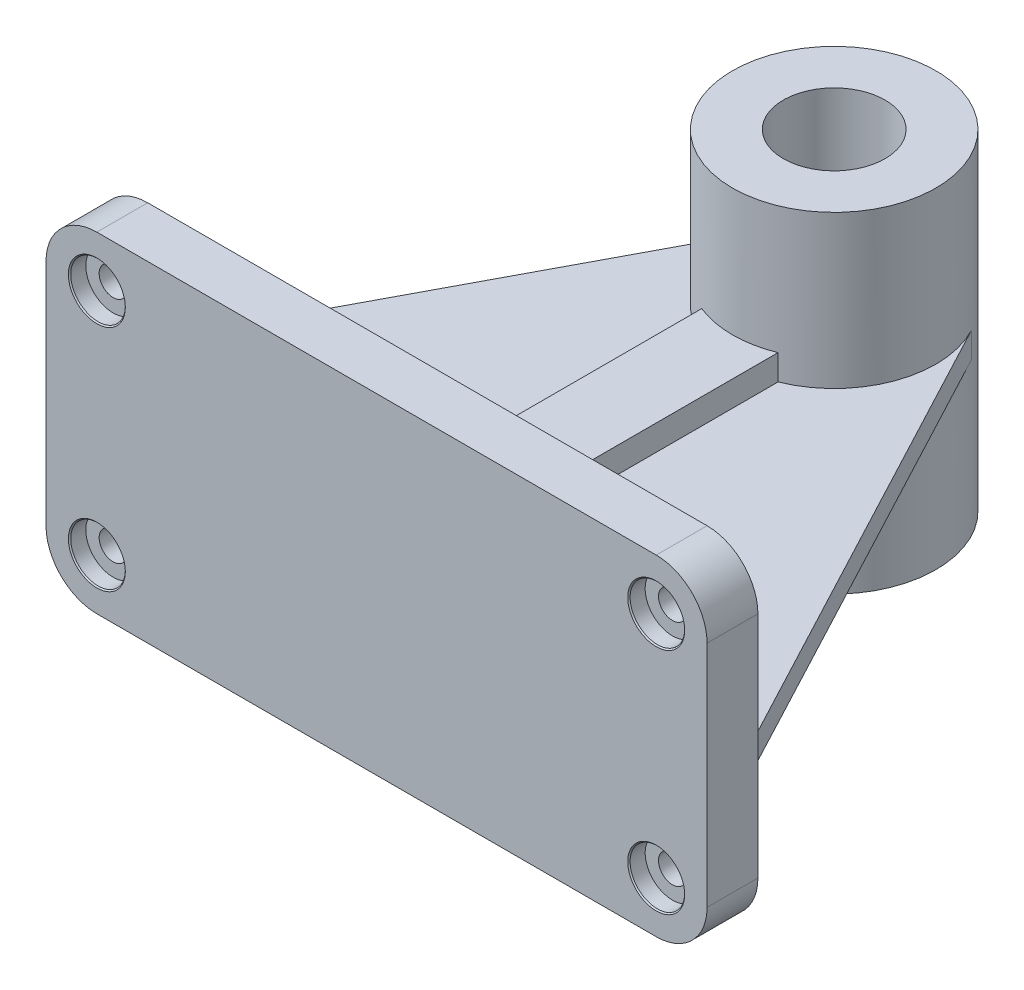
ISO-10303-21;
HEADER;
FILE_DESCRIPTION(('STEP AP214'),'2;1');
FILE_NAME('part.step','',(''),(''),'','','');
FILE_SCHEMA(('AUTOMOTIVE_DESIGN { 1 0 10303 214 1 1 1 1 }'));
ENDSEC;
DATA;
#1=APPLICATION_CONTEXT('core data for automotive mechanical design processes');
#2=APPLICATION_PROTOCOL_DEFINITION('international standard','automotive_design',2000,#1);
#3=PRODUCT_CONTEXT('',#1,'mechanical');
#4=PRODUCT('Part','Part','',(#3));
#5=PRODUCT_RELATED_PRODUCT_CATEGORY('part','',(#4));
#6=PRODUCT_DEFINITION_FORMATION('','',#4);
#7=PRODUCT_DEFINITION_CONTEXT('part definition',#1,'design');
#8=PRODUCT_DEFINITION('design','',#6,#7);
#9=PRODUCT_DEFINITION_SHAPE('','',#8);
#10=(LENGTH_UNIT() NAMED_UNIT(*) SI_UNIT(.MILLI.,.METRE.));
#11=(NAMED_UNIT(*) PLANE_ANGLE_UNIT() SI_UNIT($,.RADIAN.));
#12=(NAMED_UNIT(*) SI_UNIT($,.STERADIAN.) SOLID_ANGLE_UNIT());
#13=UNCERTAINTY_MEASURE_WITH_UNIT(LENGTH_MEASURE(1.E-05),#10,'distance_accuracy_value','');
#14=(GEOMETRIC_REPRESENTATION_CONTEXT(3) GLOBAL_UNCERTAINTY_ASSIGNED_CONTEXT((#13)) GLOBAL_UNIT_ASSIGNED_CONTEXT((#10,
#11,#12)) REPRESENTATION_CONTEXT('',''));
#15=CARTESIAN_POINT('',(0.,0.,0.));
#16=DIRECTION('',(0.,0.,1.));
#17=DIRECTION('',(1.,0.,0.));
#18=AXIS2_PLACEMENT_3D('',#15,#16,#17);
#19=CARTESIAN_POINT('',(0.,0.,0.));
#20=DIRECTION('',(0.,0.,1.));
#21=DIRECTION('',(1.,0.,0.));
#22=AXIS2_PLACEMENT_3D('',#19,#20,#21);
#23=PLANE('',#22);
#24=CARTESIAN_POINT('',(110.,-45.,0.));
#25=DIRECTION('',(0.,0.,1.));
#26=DIRECTION('',(1.,0.,0.));
#27=AXIS2_PLACEMENT_3D('',#24,#25,#26);
#28=CIRCLE('',#27,5.49999999999999);
#29=CARTESIAN_POINT('',(115.5,-45.,0.));
#30=VERTEX_POINT('',#29);
#31=EDGE_CURVE('E294',#30,#30,#28,.T.);
#32=ORIENTED_EDGE('',*,*,#31,.T.);
#33=EDGE_LOOP('',(#32));
#34=FACE_BOUND('',#33,.T.);
#35=CARTESIAN_POINT('',(-110.,-45.,0.));
#36=DIRECTION('',(0.,0.,1.));
#37=DIRECTION('',(1.,0.,0.));
#38=AXIS2_PLACEMENT_3D('',#35,#36,#37);
#39=CIRCLE('',#38,5.49999999999999);
#40=CARTESIAN_POINT('',(-104.5,-45.,0.));
#41=VERTEX_POINT('',#40);
#42=EDGE_CURVE('E307',#41,#41,#39,.T.);
#43=ORIENTED_EDGE('',*,*,#42,.T.);
#44=EDGE_LOOP('',(#43));
#45=FACE_BOUND('',#44,.T.);
#46=DIRECTION('',(1.,0.,0.));
#47=VECTOR('',#46,1.);
#48=CARTESIAN_POINT('',(-130.,-65.,0.));
#49=LINE('',#48,#47);
#50=CARTESIAN_POINT('',(-110.,-65.,0.));
#51=VERTEX_POINT('',#50);
#52=CARTESIAN_POINT('',(110.,-65.,0.));
#53=VERTEX_POINT('',#52);
#54=EDGE_CURVE('E337',#51,#53,#49,.T.);
#55=ORIENTED_EDGE('',*,*,#54,.F.);
#56=CARTESIAN_POINT('',(-110.,-45.,0.));
#57=DIRECTION('',(0.,0.,1.));
#58=DIRECTION('',(1.,0.,0.));
#59=AXIS2_PLACEMENT_3D('',#56,#57,#58);
#60=CIRCLE('',#59,20.);
#61=CARTESIAN_POINT('',(-130.,-45.,0.));
#62=VERTEX_POINT('',#61);
#63=EDGE_CURVE('E368',#51,#62,#60,.F.);
#64=ORIENTED_EDGE('',*,*,#63,.T.);
#65=DIRECTION('',(0.,-1.,0.));
#66=VECTOR('',#65,1.);
#67=CARTESIAN_POINT('',(-130.,65.,0.));
#68=LINE('',#67,#66);
#69=CARTESIAN_POINT('',(-130.,-5.,0.));
#70=VERTEX_POINT('',#69);
#71=EDGE_CURVE('E338',#70,#62,#68,.T.);
#72=ORIENTED_EDGE('',*,*,#71,.F.);
#73=DIRECTION('',(-1.,0.,0.));
#74=VECTOR('',#73,1.);
#75=CARTESIAN_POINT('',(0.,-5.,0.));
#76=LINE('',#75,#74);
#77=CARTESIAN_POINT('',(-15.,-5.,0.));
#78=VERTEX_POINT('',#77);
#79=EDGE_CURVE('E191',#78,#70,#76,.T.);
#80=ORIENTED_EDGE('',*,*,#79,.F.);
#81=DIRECTION('',(0.,-1.,0.));
#82=VECTOR('',#81,1.);
#83=CARTESIAN_POINT('',(-15.,15.,0.));
#84=LINE('',#83,#82);
#85=CARTESIAN_POINT('',(-15.,-15.,0.));
#86=VERTEX_POINT('',#85);
#87=EDGE_CURVE('E188',#78,#86,#84,.T.);
#88=ORIENTED_EDGE('',*,*,#87,.T.);
#89=DIRECTION('',(1.,0.,0.));
#90=VECTOR('',#89,1.);
#91=CARTESIAN_POINT('',(-15.,-15.,0.));
#92=LINE('',#91,#90);
#93=CARTESIAN_POINT('',(15.,-15.,0.));
#94=VERTEX_POINT('',#93);
#95=EDGE_CURVE('E237',#86,#94,#92,.T.);
#96=ORIENTED_EDGE('',*,*,#95,.T.);
#97=DIRECTION('',(0.,-1.,0.));
#98=VECTOR('',#97,1.);
#99=CARTESIAN_POINT('',(15.,15.,0.));
#100=LINE('',#99,#98);
#101=CARTESIAN_POINT('',(15.,-5.,0.));
#102=VERTEX_POINT('',#101);
#103=EDGE_CURVE('E265',#102,#94,#100,.T.);
#104=ORIENTED_EDGE('',*,*,#103,.F.);
#105=DIRECTION('',(-1.,0.,0.));
#106=VECTOR('',#105,1.);
#107=CARTESIAN_POINT('',(0.,-5.,0.));
#108=LINE('',#107,#106);
#109=CARTESIAN_POINT('',(130.,-5.,0.));
#110=VERTEX_POINT('',#109);
#111=EDGE_CURVE('E223',#110,#102,#108,.T.);
#112=ORIENTED_EDGE('',*,*,#111,.F.);
#113=DIRECTION('',(0.,1.,0.));
#114=VECTOR('',#113,1.);
#115=CARTESIAN_POINT('',(130.,65.,0.));
#116=LINE('',#115,#114);
#117=CARTESIAN_POINT('',(130.,-45.,0.));
#118=VERTEX_POINT('',#117);
#119=EDGE_CURVE('E342',#118,#110,#116,.T.);
#120=ORIENTED_EDGE('',*,*,#119,.F.);
#121=CARTESIAN_POINT('',(110.,-45.,0.));
#122=DIRECTION('',(0.,0.,1.));
#123=DIRECTION('',(1.,0.,0.));
#124=AXIS2_PLACEMENT_3D('',#121,#122,#123);
#125=CIRCLE('',#124,20.);
#126=EDGE_CURVE('E366',#118,#53,#125,.F.);
#127=ORIENTED_EDGE('',*,*,#126,.T.);
#128=EDGE_LOOP('',(#55,#64,#72,#80,#88,#96,#104,#112,#120,#127));
#129=FACE_BOUND('',#128,.T.);
#130=ADVANCED_FACE('F34',(#34,#45,#129),#23,.F.);
#131=CARTESIAN_POINT('',(-15.,15.,-122.919007564522));
#132=DIRECTION('',(1.,0.,0.));
#133=DIRECTION('',(0.,0.,-1.));
#134=AXIS2_PLACEMENT_3D('',#131,#132,#133);
#135=PLANE('',#134);
#136=DIRECTION('',(0.,0.,1.));
#137=VECTOR('',#136,1.);
#138=CARTESIAN_POINT('',(-15.,-5.,-122.919007564522));
#139=LINE('',#138,#137);
#140=CARTESIAN_POINT('',(-15.,-5.,-122.919007564522));
#141=VERTEX_POINT('',#140);
#142=EDGE_CURVE('E186',#141,#78,#139,.T.);
#143=ORIENTED_EDGE('',*,*,#142,.F.);
#144=DIRECTION('',(0.,-1.,0.));
#145=VECTOR('',#144,1.);
#146=CARTESIAN_POINT('',(-15.,15.,-122.919007564522));
#147=LINE('',#146,#145);
#148=CARTESIAN_POINT('',(-15.,-15.,-122.919007564522));
#149=VERTEX_POINT('',#148);
#150=EDGE_CURVE('E169',#141,#149,#147,.T.);
#151=ORIENTED_EDGE('',*,*,#150,.T.);
#152=DIRECTION('',(0.,0.,1.));
#153=VECTOR('',#152,1.);
#154=CARTESIAN_POINT('',(-15.,-15.,-122.919007564522));
#155=LINE('',#154,#153);
#156=EDGE_CURVE('E244',#149,#86,#155,.T.);
#157=ORIENTED_EDGE('',*,*,#156,.T.);
#158=ORIENTED_EDGE('',*,*,#87,.F.);
#159=EDGE_LOOP('',(#143,#151,#157,#158));
#160=FACE_BOUND('',#159,.T.);
#161=ADVANCED_FACE('F187',(#160),#135,.F.);
#162=CARTESIAN_POINT('',(15.,15.,-122.919007564522));
#163=DIRECTION('',(-1.,0.,0.));
#164=DIRECTION('',(0.,0.,1.));
#165=AXIS2_PLACEMENT_3D('',#162,#163,#164);
#166=PLANE('',#165);
#167=DIRECTION('',(0.,0.,-1.));
#168=VECTOR('',#167,1.);
#169=CARTESIAN_POINT('',(15.,-5.,-122.919007564522));
#170=LINE('',#169,#168);
#171=CARTESIAN_POINT('',(15.,-5.,-122.919007564522));
#172=VERTEX_POINT('',#171);
#173=EDGE_CURVE('E218',#102,#172,#170,.T.);
#174=ORIENTED_EDGE('',*,*,#173,.F.);
#175=ORIENTED_EDGE('',*,*,#103,.T.);
#176=DIRECTION('',(0.,0.,-1.));
#177=VECTOR('',#176,1.);
#178=CARTESIAN_POINT('',(15.,-15.,-122.919007564522));
#179=LINE('',#178,#177);
#180=CARTESIAN_POINT('',(15.,-15.,-122.919007564522));
#181=VERTEX_POINT('',#180);
#182=EDGE_CURVE('E253',#94,#181,#179,.T.);
#183=ORIENTED_EDGE('',*,*,#182,.T.);
#184=DIRECTION('',(0.,-1.,0.));
#185=VECTOR('',#184,1.);
#186=CARTESIAN_POINT('',(15.,15.,-122.919007564522));
#187=LINE('',#186,#185);
#188=EDGE_CURVE('E261',#172,#181,#187,.T.);
#189=ORIENTED_EDGE('',*,*,#188,.F.);
#190=EDGE_LOOP('',(#174,#175,#183,#189));
#191=FACE_BOUND('',#190,.T.);
#192=ADVANCED_FACE('F430',(#191),#166,.F.);
#193=CARTESIAN_POINT('',(-130.,65.,20.));
#194=DIRECTION('',(1.,0.,0.));
#195=DIRECTION('',(0.,1.,0.));
#196=AXIS2_PLACEMENT_3D('',#193,#194,#195);
#197=PLANE('',#196);
#198=ORIENTED_EDGE('',*,*,#71,.T.);
#199=DIRECTION('',(0.,0.,-1.));
#200=VECTOR('',#199,1.);
#201=CARTESIAN_POINT('',(-130.,-45.,20.));
#202=LINE('',#201,#200);
#203=CARTESIAN_POINT('',(-130.,-45.,20.));
#204=VERTEX_POINT('',#203);
#205=EDGE_CURVE('E373',#62,#204,#202,.F.);
#206=ORIENTED_EDGE('',*,*,#205,.T.);
#207=DIRECTION('',(0.,-1.,0.));
#208=VECTOR('',#207,1.);
#209=CARTESIAN_POINT('',(-130.,65.,20.));
#210=LINE('',#209,#208);
#211=CARTESIAN_POINT('',(-130.,45.,20.));
#212=VERTEX_POINT('',#211);
#213=EDGE_CURVE('E321',#212,#204,#210,.T.);
#214=ORIENTED_EDGE('',*,*,#213,.F.);
#215=DIRECTION('',(0.,0.,-1.));
#216=VECTOR('',#215,1.);
#217=CARTESIAN_POINT('',(-130.,45.,20.));
#218=LINE('',#217,#216);
#219=CARTESIAN_POINT('',(-130.,45.,0.));
#220=VERTEX_POINT('',#219);
#221=EDGE_CURVE('E370',#212,#220,#218,.T.);
#222=ORIENTED_EDGE('',*,*,#221,.T.);
#223=CARTESIAN_POINT('',(-130.,5.,0.));
#224=VERTEX_POINT('',#223);
#225=EDGE_CURVE('E335',#220,#224,#68,.T.);
#226=ORIENTED_EDGE('',*,*,#225,.T.);
#227=DIRECTION('',(0.,1.,0.));
#228=VECTOR('',#227,1.);
#229=CARTESIAN_POINT('',(-130.,0.,0.));
#230=LINE('',#229,#228);
#231=EDGE_CURVE('E211',#224,#70,#230,.F.);
#232=ORIENTED_EDGE('',*,*,#231,.T.);
#233=EDGE_LOOP('',(#198,#206,#214,#222,#226,#232));
#234=FACE_BOUND('',#233,.T.);
#235=ADVANCED_FACE('F442',(#234),#197,.F.);
#236=CARTESIAN_POINT('',(-130.,-65.,20.));
#237=DIRECTION('',(0.,1.,0.));
#238=DIRECTION('',(-1.,0.,0.));
#239=AXIS2_PLACEMENT_3D('',#236,#237,#238);
#240=PLANE('',#239);
#241=DIRECTION('',(1.,0.,0.));
#242=VECTOR('',#241,1.);
#243=CARTESIAN_POINT('',(-130.,-65.,20.));
#244=LINE('',#243,#242);
#245=CARTESIAN_POINT('',(-110.,-65.,20.));
#246=VERTEX_POINT('',#245);
#247=CARTESIAN_POINT('',(110.,-65.,20.));
#248=VERTEX_POINT('',#247);
#249=EDGE_CURVE('E324',#246,#248,#244,.T.);
#250=ORIENTED_EDGE('',*,*,#249,.F.);
#251=DIRECTION('',(0.,0.,-1.));
#252=VECTOR('',#251,1.);
#253=CARTESIAN_POINT('',(-110.,-65.,20.));
#254=LINE('',#253,#252);
#255=EDGE_CURVE('E363',#246,#51,#254,.T.);
#256=ORIENTED_EDGE('',*,*,#255,.T.);
#257=ORIENTED_EDGE('',*,*,#54,.T.);
#258=DIRECTION('',(0.,0.,-1.));
#259=VECTOR('',#258,1.);
#260=CARTESIAN_POINT('',(110.,-65.,20.));
#261=LINE('',#260,#259);
#262=EDGE_CURVE('E361',#53,#248,#261,.F.);
#263=ORIENTED_EDGE('',*,*,#262,.T.);
#264=EDGE_LOOP('',(#250,#256,#257,#263));
#265=FACE_BOUND('',#264,.T.);
#266=ADVANCED_FACE('F439',(#265),#240,.F.);
#267=CARTESIAN_POINT('',(130.,65.,20.));
#268=DIRECTION('',(-1.,0.,0.));
#269=DIRECTION('',(0.,-1.,0.));
#270=AXIS2_PLACEMENT_3D('',#267,#268,#269);
#271=PLANE('',#270);
#272=DIRECTION('',(0.,1.,0.));
#273=VECTOR('',#272,1.);
#274=CARTESIAN_POINT('',(130.,65.,20.));
#275=LINE('',#274,#273);
#276=CARTESIAN_POINT('',(130.,-45.,20.));
#277=VERTEX_POINT('',#276);
#278=CARTESIAN_POINT('',(130.,45.,20.));
#279=VERTEX_POINT('',#278);
#280=EDGE_CURVE('E328',#277,#279,#275,.T.);
#281=ORIENTED_EDGE('',*,*,#280,.F.);
#282=DIRECTION('',(0.,0.,-1.));
#283=VECTOR('',#282,1.);
#284=CARTESIAN_POINT('',(130.,-45.,20.));
#285=LINE('',#284,#283);
#286=EDGE_CURVE('E11',#277,#118,#285,.T.);
#287=ORIENTED_EDGE('',*,*,#286,.T.);
#288=ORIENTED_EDGE('',*,*,#119,.T.);
#289=DIRECTION('',(0.,1.,0.));
#290=VECTOR('',#289,1.);
#291=CARTESIAN_POINT('',(130.,0.,0.));
#292=LINE('',#291,#290);
#293=CARTESIAN_POINT('',(130.,5.,0.));
#294=VERTEX_POINT('',#293);
#295=EDGE_CURVE('E230',#110,#294,#292,.T.);
#296=ORIENTED_EDGE('',*,*,#295,.T.);
#297=CARTESIAN_POINT('',(130.,45.,0.));
#298=VERTEX_POINT('',#297);
#299=EDGE_CURVE('E341',#294,#298,#116,.T.);
#300=ORIENTED_EDGE('',*,*,#299,.T.);
#301=DIRECTION('',(0.,0.,-1.));
#302=VECTOR('',#301,1.);
#303=CARTESIAN_POINT('',(130.,45.,20.));
#304=LINE('',#303,#302);
#305=EDGE_CURVE('E42',#298,#279,#304,.F.);
#306=ORIENTED_EDGE('',*,*,#305,.T.);
#307=EDGE_LOOP('',(#281,#287,#288,#296,#300,#306));
#308=FACE_BOUND('',#307,.T.);
#309=ADVANCED_FACE('F392',(#308),#271,.F.);
#310=CARTESIAN_POINT('',(-130.,65.,20.));
#311=DIRECTION('',(0.,-1.,0.));
#312=DIRECTION('',(1.,0.,0.));
#313=AXIS2_PLACEMENT_3D('',#310,#311,#312);
#314=PLANE('',#313);
#315=DIRECTION('',(-1.,0.,0.));
#316=VECTOR('',#315,1.);
#317=CARTESIAN_POINT('',(-130.,65.,0.));
#318=LINE('',#317,#316);
#319=CARTESIAN_POINT('',(110.,65.,0.));
#320=VERTEX_POINT('',#319);
#321=CARTESIAN_POINT('',(-110.,65.,0.));
#322=VERTEX_POINT('',#321);
#323=EDGE_CURVE('E325',#320,#322,#318,.T.);
#324=ORIENTED_EDGE('',*,*,#323,.T.);
#325=DIRECTION('',(0.,0.,-1.));
#326=VECTOR('',#325,1.);
#327=CARTESIAN_POINT('',(-110.,65.,20.));
#328=LINE('',#327,#326);
#329=CARTESIAN_POINT('',(-110.,65.,20.));
#330=VERTEX_POINT('',#329);
#331=EDGE_CURVE('E388',#322,#330,#328,.F.);
#332=ORIENTED_EDGE('',*,*,#331,.T.);
#333=DIRECTION('',(-1.,0.,0.));
#334=VECTOR('',#333,1.);
#335=CARTESIAN_POINT('',(-130.,65.,20.));
#336=LINE('',#335,#334);
#337=CARTESIAN_POINT('',(110.,65.,20.));
#338=VERTEX_POINT('',#337);
#339=EDGE_CURVE('E331',#338,#330,#336,.T.);
#340=ORIENTED_EDGE('',*,*,#339,.F.);
#341=DIRECTION('',(0.,0.,-1.));
#342=VECTOR('',#341,1.);
#343=CARTESIAN_POINT('',(110.,65.,20.));
#344=LINE('',#343,#342);
#345=EDGE_CURVE('E385',#338,#320,#344,.T.);
#346=ORIENTED_EDGE('',*,*,#345,.T.);
#347=EDGE_LOOP('',(#324,#332,#340,#346));
#348=FACE_BOUND('',#347,.T.);
#349=ADVANCED_FACE('F403',(#348),#314,.F.);
#350=CARTESIAN_POINT('',(0.,0.,20.));
#351=DIRECTION('',(0.,0.,1.));
#352=DIRECTION('',(1.,0.,0.));
#353=AXIS2_PLACEMENT_3D('',#350,#351,#352);
#354=PLANE('',#353);
#355=ORIENTED_EDGE('',*,*,#213,.T.);
#356=CARTESIAN_POINT('',(-110.,-45.,20.));
#357=DIRECTION('',(0.,0.,1.));
#358=DIRECTION('',(1.,0.,0.));
#359=AXIS2_PLACEMENT_3D('',#356,#357,#358);
#360=CIRCLE('',#359,20.);
#361=EDGE_CURVE('E381',#204,#246,#360,.T.);
#362=ORIENTED_EDGE('',*,*,#361,.T.);
#363=ORIENTED_EDGE('',*,*,#249,.T.);
#364=CARTESIAN_POINT('',(110.,-45.,20.));
#365=DIRECTION('',(0.,0.,1.));
#366=DIRECTION('',(1.,0.,0.));
#367=AXIS2_PLACEMENT_3D('',#364,#365,#366);
#368=CIRCLE('',#367,20.);
#369=EDGE_CURVE('E377',#248,#277,#368,.T.);
#370=ORIENTED_EDGE('',*,*,#369,.T.);
#371=ORIENTED_EDGE('',*,*,#280,.T.);
#372=CARTESIAN_POINT('',(110.,45.,20.));
#373=DIRECTION('',(0.,0.,1.));
#374=DIRECTION('',(1.,0.,0.));
#375=AXIS2_PLACEMENT_3D('',#372,#373,#374);
#376=CIRCLE('',#375,20.);
#377=EDGE_CURVE('E375',#279,#338,#376,.T.);
#378=ORIENTED_EDGE('',*,*,#377,.T.);
#379=ORIENTED_EDGE('',*,*,#339,.T.);
#380=CARTESIAN_POINT('',(-110.,45.,20.));
#381=DIRECTION('',(0.,0.,1.));
#382=DIRECTION('',(1.,0.,0.));
#383=AXIS2_PLACEMENT_3D('',#380,#381,#382);
#384=CIRCLE('',#383,20.);
#385=EDGE_CURVE('E379',#330,#212,#384,.T.);
#386=ORIENTED_EDGE('',*,*,#385,.T.);
#387=EDGE_LOOP('',(#355,#362,#363,#370,#371,#378,#379,#386));
#388=FACE_BOUND('',#387,.T.);
#389=CARTESIAN_POINT('',(110.,45.,20.));
#390=DIRECTION('',(0.,0.,1.));
#391=DIRECTION('',(1.,0.,0.));
#392=AXIS2_PLACEMENT_3D('',#389,#390,#391);
#393=CIRCLE('',#392,11.2);
#394=CARTESIAN_POINT('',(121.2,45.,20.));
#395=VERTEX_POINT('',#394);
#396=EDGE_CURVE('E269',#395,#395,#393,.T.);
#397=ORIENTED_EDGE('',*,*,#396,.F.);
#398=EDGE_LOOP('',(#397));
#399=FACE_BOUND('',#398,.T.);
#400=CARTESIAN_POINT('',(-110.,45.,20.));
#401=DIRECTION('',(0.,0.,1.));
#402=DIRECTION('',(1.,0.,0.));
#403=AXIS2_PLACEMENT_3D('',#400,#401,#402);
#404=CIRCLE('',#403,11.2);
#405=CARTESIAN_POINT('',(-98.8,45.,20.));
#406=VERTEX_POINT('',#405);
#407=EDGE_CURVE('E308',#406,#406,#404,.T.);
#408=ORIENTED_EDGE('',*,*,#407,.F.);
#409=EDGE_LOOP('',(#408));
#410=FACE_BOUND('',#409,.T.);
#411=CARTESIAN_POINT('',(110.,-45.,20.));
#412=DIRECTION('',(0.,0.,1.));
#413=DIRECTION('',(1.,0.,0.));
#414=AXIS2_PLACEMENT_3D('',#411,#412,#413);
#415=CIRCLE('',#414,11.2);
#416=CARTESIAN_POINT('',(121.2,-45.,20.));
#417=VERTEX_POINT('',#416);
#418=EDGE_CURVE('E282',#417,#417,#415,.T.);
#419=ORIENTED_EDGE('',*,*,#418,.F.);
#420=EDGE_LOOP('',(#419));
#421=FACE_BOUND('',#420,.T.);
#422=CARTESIAN_POINT('',(-110.,-45.,20.));
#423=DIRECTION('',(0.,0.,1.));
#424=DIRECTION('',(1.,0.,0.));
#425=AXIS2_PLACEMENT_3D('',#422,#423,#424);
#426=CIRCLE('',#425,11.2);
#427=CARTESIAN_POINT('',(-98.8,-45.,20.));
#428=VERTEX_POINT('',#427);
#429=EDGE_CURVE('E295',#428,#428,#426,.T.);
#430=ORIENTED_EDGE('',*,*,#429,.F.);
#431=EDGE_LOOP('',(#430));
#432=FACE_BOUND('',#431,.T.);
#433=ADVANCED_FACE('F397',(#388,#399,#410,#421,#432),#354,.T.);
#434=ORIENTED_EDGE('',*,*,#225,.F.);
#435=CARTESIAN_POINT('',(-110.,45.,0.));
#436=DIRECTION('',(0.,0.,1.));
#437=DIRECTION('',(1.,0.,0.));
#438=AXIS2_PLACEMENT_3D('',#435,#436,#437);
#439=CIRCLE('',#438,20.);
#440=EDGE_CURVE('E55',#220,#322,#439,.F.);
#441=ORIENTED_EDGE('',*,*,#440,.T.);
#442=ORIENTED_EDGE('',*,*,#323,.F.);
#443=CARTESIAN_POINT('',(110.,45.,0.));
#444=DIRECTION('',(0.,0.,1.));
#445=DIRECTION('',(1.,0.,0.));
#446=AXIS2_PLACEMENT_3D('',#443,#444,#445);
#447=CIRCLE('',#446,20.);
#448=EDGE_CURVE('E49',#320,#298,#447,.F.);
#449=ORIENTED_EDGE('',*,*,#448,.T.);
#450=ORIENTED_EDGE('',*,*,#299,.F.);
#451=DIRECTION('',(-1.,0.,0.));
#452=VECTOR('',#451,1.);
#453=CARTESIAN_POINT('',(0.,5.,0.));
#454=LINE('',#453,#452);
#455=CARTESIAN_POINT('',(15.,5.,0.));
#456=VERTEX_POINT('',#455);
#457=EDGE_CURVE('E228',#294,#456,#454,.T.);
#458=ORIENTED_EDGE('',*,*,#457,.T.);
#459=CARTESIAN_POINT('',(15.,15.,0.));
#460=VERTEX_POINT('',#459);
#461=EDGE_CURVE('E266',#460,#456,#100,.T.);
#462=ORIENTED_EDGE('',*,*,#461,.F.);
#463=DIRECTION('',(1.,0.,0.));
#464=VECTOR('',#463,1.);
#465=CARTESIAN_POINT('',(-15.,15.,0.));
#466=LINE('',#465,#464);
#467=CARTESIAN_POINT('',(-15.,15.,0.));
#468=VERTEX_POINT('',#467);
#469=EDGE_CURVE('E240',#468,#460,#466,.T.);
#470=ORIENTED_EDGE('',*,*,#469,.F.);
#471=CARTESIAN_POINT('',(-15.,5.,0.));
#472=VERTEX_POINT('',#471);
#473=EDGE_CURVE('E182',#468,#472,#84,.T.);
#474=ORIENTED_EDGE('',*,*,#473,.T.);
#475=DIRECTION('',(-1.,0.,0.));
#476=VECTOR('',#475,1.);
#477=CARTESIAN_POINT('',(0.,5.,0.));
#478=LINE('',#477,#476);
#479=EDGE_CURVE('E208',#472,#224,#478,.T.);
#480=ORIENTED_EDGE('',*,*,#479,.T.);
#481=EDGE_LOOP('',(#434,#441,#442,#449,#450,#458,#462,#470,#474,#480));
#482=FACE_BOUND('',#481,.T.);
#483=CARTESIAN_POINT('',(110.,45.,0.));
#484=DIRECTION('',(0.,0.,1.));
#485=DIRECTION('',(1.,0.,0.));
#486=AXIS2_PLACEMENT_3D('',#483,#484,#485);
#487=CIRCLE('',#486,5.49999999999999);
#488=CARTESIAN_POINT('',(115.5,45.,0.));
#489=VERTEX_POINT('',#488);
#490=EDGE_CURVE('E281',#489,#489,#487,.T.);
#491=ORIENTED_EDGE('',*,*,#490,.T.);
#492=EDGE_LOOP('',(#491));
#493=FACE_BOUND('',#492,.T.);
#494=CARTESIAN_POINT('',(-110.,45.,0.));
#495=DIRECTION('',(0.,0.,1.));
#496=DIRECTION('',(1.,0.,0.));
#497=AXIS2_PLACEMENT_3D('',#494,#495,#496);
#498=CIRCLE('',#497,5.49999999999999);
#499=CARTESIAN_POINT('',(-104.5,45.,0.));
#500=VERTEX_POINT('',#499);
#501=EDGE_CURVE('E320',#500,#500,#498,.T.);
#502=ORIENTED_EDGE('',*,*,#501,.T.);
#503=EDGE_LOOP('',(#502));
#504=FACE_BOUND('',#503,.T.);
#505=ADVANCED_FACE('F405',(#482,#493,#504),#23,.F.);
#506=CARTESIAN_POINT('',(-110.,45.,20.));
#507=DIRECTION('',(0.,0.,1.));
#508=DIRECTION('',(1.,0.,0.));
#509=AXIS2_PLACEMENT_3D('',#506,#507,#508);
#510=CYLINDRICAL_SURFACE('',#509,5.49999999999999);
#511=CARTESIAN_POINT('',(-110.,45.,13.6));
#512=DIRECTION('',(0.,0.,1.));
#513=DIRECTION('',(1.,0.,0.));
#514=AXIS2_PLACEMENT_3D('',#511,#512,#513);
#515=CIRCLE('',#514,5.49999999999999);
#516=CARTESIAN_POINT('',(-104.5,45.,13.6));
#517=VERTEX_POINT('',#516);
#518=EDGE_CURVE('E317',#517,#517,#515,.T.);
#519=ORIENTED_EDGE('',*,*,#518,.T.);
#520=EDGE_LOOP('',(#519));
#521=FACE_BOUND('',#520,.T.);
#522=ORIENTED_EDGE('',*,*,#501,.F.);
#523=EDGE_LOOP('',(#522));
#524=FACE_BOUND('',#523,.T.);
#525=ADVANCED_FACE('F408',(#521,#524),#510,.F.);
#526=CARTESIAN_POINT('',(-104.5,45.,13.6));
#527=DIRECTION('',(0.,0.,-1.));
#528=DIRECTION('',(-1.,0.,0.));
#529=AXIS2_PLACEMENT_3D('',#526,#527,#528);
#530=PLANE('',#529);
#531=ORIENTED_EDGE('',*,*,#518,.F.);
#532=EDGE_LOOP('',(#531));
#533=FACE_BOUND('',#532,.T.);
#534=CARTESIAN_POINT('',(-110.,45.,13.6));
#535=DIRECTION('',(0.,0.,1.));
#536=DIRECTION('',(1.,0.,0.));
#537=AXIS2_PLACEMENT_3D('',#534,#535,#536);
#538=CIRCLE('',#537,10.7375);
#539=CARTESIAN_POINT('',(-99.2625,45.,13.6));
#540=VERTEX_POINT('',#539);
#541=EDGE_CURVE('E314',#540,#540,#538,.T.);
#542=ORIENTED_EDGE('',*,*,#541,.T.);
#543=EDGE_LOOP('',(#542));
#544=FACE_BOUND('',#543,.T.);
#545=ADVANCED_FACE('F415',(#533,#544),#530,.F.);
#546=CARTESIAN_POINT('',(-110.,45.,20.));
#547=DIRECTION('',(0.,0.,1.));
#548=DIRECTION('',(1.,0.,0.));
#549=AXIS2_PLACEMENT_3D('',#546,#547,#548);
#550=CYLINDRICAL_SURFACE('',#549,10.7375);
#551=ORIENTED_EDGE('',*,*,#541,.F.);
#552=EDGE_LOOP('',(#551));
#553=FACE_BOUND('',#552,.T.);
#554=CARTESIAN_POINT('',(-110.,45.,19.5375));
#555=DIRECTION('',(0.,0.,1.));
#556=DIRECTION('',(1.,0.,0.));
#557=AXIS2_PLACEMENT_3D('',#554,#555,#556);
#558=CIRCLE('',#557,10.7375);
#559=CARTESIAN_POINT('',(-99.2625,45.,19.5375));
#560=VERTEX_POINT('',#559);
#561=EDGE_CURVE('E311',#560,#560,#558,.T.);
#562=ORIENTED_EDGE('',*,*,#561,.T.);
#563=EDGE_LOOP('',(#562));
#564=FACE_BOUND('',#563,.T.);
#565=ADVANCED_FACE('F421',(#553,#564),#550,.F.);
#566=CARTESIAN_POINT('',(-110.,45.,20.));
#567=DIRECTION('',(0.,0.,1.));
#568=DIRECTION('',(1.,0.,0.));
#569=AXIS2_PLACEMENT_3D('',#566,#567,#568);
#570=CONICAL_SURFACE('',#569,11.2,0.785398163397452);
#571=ORIENTED_EDGE('',*,*,#561,.F.);
#572=EDGE_LOOP('',(#571));
#573=FACE_BOUND('',#572,.T.);
#574=ORIENTED_EDGE('',*,*,#407,.T.);
#575=EDGE_LOOP('',(#574));
#576=FACE_BOUND('',#575,.T.);
#577=ADVANCED_FACE('F576',(#573,#576),#570,.F.);
#578=CARTESIAN_POINT('',(-110.,-45.,20.));
#579=DIRECTION('',(0.,0.,1.));
#580=DIRECTION('',(1.,0.,0.));
#581=AXIS2_PLACEMENT_3D('',#578,#579,#580);
#582=CYLINDRICAL_SURFACE('',#581,5.49999999999999);
#583=CARTESIAN_POINT('',(-110.,-45.,13.6));
#584=DIRECTION('',(0.,0.,1.));
#585=DIRECTION('',(1.,0.,0.));
#586=AXIS2_PLACEMENT_3D('',#583,#584,#585);
#587=CIRCLE('',#586,5.49999999999999);
#588=CARTESIAN_POINT('',(-104.5,-45.,13.6));
#589=VERTEX_POINT('',#588);
#590=EDGE_CURVE('E304',#589,#589,#587,.T.);
#591=ORIENTED_EDGE('',*,*,#590,.T.);
#592=EDGE_LOOP('',(#591));
#593=FACE_BOUND('',#592,.T.);
#594=ORIENTED_EDGE('',*,*,#42,.F.);
#595=EDGE_LOOP('',(#594));
#596=FACE_BOUND('',#595,.T.);
#597=ADVANCED_FACE('F572',(#593,#596),#582,.F.);
#598=CARTESIAN_POINT('',(-104.5,-45.,13.6));
#599=DIRECTION('',(0.,0.,-1.));
#600=DIRECTION('',(-1.,0.,0.));
#601=AXIS2_PLACEMENT_3D('',#598,#599,#600);
#602=PLANE('',#601);
#603=ORIENTED_EDGE('',*,*,#590,.F.);
#604=EDGE_LOOP('',(#603));
#605=FACE_BOUND('',#604,.T.);
#606=CARTESIAN_POINT('',(-110.,-45.,13.6));
#607=DIRECTION('',(0.,0.,1.));
#608=DIRECTION('',(1.,0.,0.));
#609=AXIS2_PLACEMENT_3D('',#606,#607,#608);
#610=CIRCLE('',#609,10.7375);
#611=CARTESIAN_POINT('',(-99.2625,-45.,13.6));
#612=VERTEX_POINT('',#611);
#613=EDGE_CURVE('E301',#612,#612,#610,.T.);
#614=ORIENTED_EDGE('',*,*,#613,.T.);
#615=EDGE_LOOP('',(#614));
#616=FACE_BOUND('',#615,.T.);
#617=ADVANCED_FACE('F568',(#605,#616),#602,.F.);
#618=CARTESIAN_POINT('',(-110.,-45.,20.));
#619=DIRECTION('',(0.,0.,1.));
#620=DIRECTION('',(1.,0.,0.));
#621=AXIS2_PLACEMENT_3D('',#618,#619,#620);
#622=CYLINDRICAL_SURFACE('',#621,10.7375);
#623=ORIENTED_EDGE('',*,*,#613,.F.);
#624=EDGE_LOOP('',(#623));
#625=FACE_BOUND('',#624,.T.);
#626=CARTESIAN_POINT('',(-110.,-45.,19.5375));
#627=DIRECTION('',(0.,0.,1.));
#628=DIRECTION('',(1.,0.,0.));
#629=AXIS2_PLACEMENT_3D('',#626,#627,#628);
#630=CIRCLE('',#629,10.7375);
#631=CARTESIAN_POINT('',(-99.2625,-45.,19.5375));
#632=VERTEX_POINT('',#631);
#633=EDGE_CURVE('E298',#632,#632,#630,.T.);
#634=ORIENTED_EDGE('',*,*,#633,.T.);
#635=EDGE_LOOP('',(#634));
#636=FACE_BOUND('',#635,.T.);
#637=ADVANCED_FACE('F564',(#625,#636),#622,.F.);
#638=CARTESIAN_POINT('',(-110.,-45.,20.));
#639=DIRECTION('',(0.,0.,1.));
#640=DIRECTION('',(1.,0.,0.));
#641=AXIS2_PLACEMENT_3D('',#638,#639,#640);
#642=CONICAL_SURFACE('',#641,11.2,0.785398163397452);
#643=ORIENTED_EDGE('',*,*,#633,.F.);
#644=EDGE_LOOP('',(#643));
#645=FACE_BOUND('',#644,.T.);
#646=ORIENTED_EDGE('',*,*,#429,.T.);
#647=EDGE_LOOP('',(#646));
#648=FACE_BOUND('',#647,.T.);
#649=ADVANCED_FACE('F560',(#645,#648),#642,.F.);
#650=CARTESIAN_POINT('',(110.,-45.,20.));
#651=DIRECTION('',(0.,0.,1.));
#652=DIRECTION('',(1.,0.,0.));
#653=AXIS2_PLACEMENT_3D('',#650,#651,#652);
#654=CYLINDRICAL_SURFACE('',#653,5.49999999999999);
#655=CARTESIAN_POINT('',(110.,-45.,13.6));
#656=DIRECTION('',(0.,0.,1.));
#657=DIRECTION('',(1.,0.,0.));
#658=AXIS2_PLACEMENT_3D('',#655,#656,#657);
#659=CIRCLE('',#658,5.49999999999999);
#660=CARTESIAN_POINT('',(115.5,-45.,13.6));
#661=VERTEX_POINT('',#660);
#662=EDGE_CURVE('E291',#661,#661,#659,.T.);
#663=ORIENTED_EDGE('',*,*,#662,.T.);
#664=EDGE_LOOP('',(#663));
#665=FACE_BOUND('',#664,.T.);
#666=ORIENTED_EDGE('',*,*,#31,.F.);
#667=EDGE_LOOP('',(#666));
#668=FACE_BOUND('',#667,.T.);
#669=ADVANCED_FACE('F556',(#665,#668),#654,.F.);
#670=CARTESIAN_POINT('',(115.5,-45.,13.6));
#671=DIRECTION('',(0.,0.,-1.));
#672=DIRECTION('',(-1.,0.,0.));
#673=AXIS2_PLACEMENT_3D('',#670,#671,#672);
#674=PLANE('',#673);
#675=ORIENTED_EDGE('',*,*,#662,.F.);
#676=EDGE_LOOP('',(#675));
#677=FACE_BOUND('',#676,.T.);
#678=CARTESIAN_POINT('',(110.,-45.,13.6));
#679=DIRECTION('',(0.,0.,1.));
#680=DIRECTION('',(1.,0.,0.));
#681=AXIS2_PLACEMENT_3D('',#678,#679,#680);
#682=CIRCLE('',#681,10.7375);
#683=CARTESIAN_POINT('',(120.7375,-45.,13.6));
#684=VERTEX_POINT('',#683);
#685=EDGE_CURVE('E288',#684,#684,#682,.T.);
#686=ORIENTED_EDGE('',*,*,#685,.T.);
#687=EDGE_LOOP('',(#686));
#688=FACE_BOUND('',#687,.T.);
#689=ADVANCED_FACE('F552',(#677,#688),#674,.F.);
#690=CARTESIAN_POINT('',(110.,-45.,20.));
#691=DIRECTION('',(0.,0.,1.));
#692=DIRECTION('',(1.,0.,0.));
#693=AXIS2_PLACEMENT_3D('',#690,#691,#692);
#694=CYLINDRICAL_SURFACE('',#693,10.7375);
#695=ORIENTED_EDGE('',*,*,#685,.F.);
#696=EDGE_LOOP('',(#695));
#697=FACE_BOUND('',#696,.T.);
#698=CARTESIAN_POINT('',(110.,-45.,19.5375));
#699=DIRECTION('',(0.,0.,1.));
#700=DIRECTION('',(1.,0.,0.));
#701=AXIS2_PLACEMENT_3D('',#698,#699,#700);
#702=CIRCLE('',#701,10.7375);
#703=CARTESIAN_POINT('',(120.7375,-45.,19.5375));
#704=VERTEX_POINT('',#703);
#705=EDGE_CURVE('E285',#704,#704,#702,.T.);
#706=ORIENTED_EDGE('',*,*,#705,.T.);
#707=EDGE_LOOP('',(#706));
#708=FACE_BOUND('',#707,.T.);
#709=ADVANCED_FACE('F548',(#697,#708),#694,.F.);
#710=CARTESIAN_POINT('',(110.,-45.,20.));
#711=DIRECTION('',(0.,0.,1.));
#712=DIRECTION('',(1.,0.,0.));
#713=AXIS2_PLACEMENT_3D('',#710,#711,#712);
#714=CONICAL_SURFACE('',#713,11.2,0.785398163397452);
#715=ORIENTED_EDGE('',*,*,#705,.F.);
#716=EDGE_LOOP('',(#715));
#717=FACE_BOUND('',#716,.T.);
#718=ORIENTED_EDGE('',*,*,#418,.T.);
#719=EDGE_LOOP('',(#718));
#720=FACE_BOUND('',#719,.T.);
#721=ADVANCED_FACE('F544',(#717,#720),#714,.F.);
#722=CARTESIAN_POINT('',(110.,45.,20.));
#723=DIRECTION('',(0.,0.,1.));
#724=DIRECTION('',(1.,0.,0.));
#725=AXIS2_PLACEMENT_3D('',#722,#723,#724);
#726=CYLINDRICAL_SURFACE('',#725,5.49999999999999);
#727=CARTESIAN_POINT('',(110.,45.,13.6));
#728=DIRECTION('',(0.,0.,1.));
#729=DIRECTION('',(1.,0.,0.));
#730=AXIS2_PLACEMENT_3D('',#727,#728,#729);
#731=CIRCLE('',#730,5.49999999999999);
#732=CARTESIAN_POINT('',(115.5,45.,13.6));
#733=VERTEX_POINT('',#732);
#734=EDGE_CURVE('E278',#733,#733,#731,.T.);
#735=ORIENTED_EDGE('',*,*,#734,.T.);
#736=EDGE_LOOP('',(#735));
#737=FACE_BOUND('',#736,.T.);
#738=ORIENTED_EDGE('',*,*,#490,.F.);
#739=EDGE_LOOP('',(#738));
#740=FACE_BOUND('',#739,.T.);
#741=ADVANCED_FACE('F540',(#737,#740),#726,.F.);
#742=CARTESIAN_POINT('',(115.5,45.,13.6));
#743=DIRECTION('',(0.,0.,-1.));
#744=DIRECTION('',(-1.,0.,0.));
#745=AXIS2_PLACEMENT_3D('',#742,#743,#744);
#746=PLANE('',#745);
#747=ORIENTED_EDGE('',*,*,#734,.F.);
#748=EDGE_LOOP('',(#747));
#749=FACE_BOUND('',#748,.T.);
#750=CARTESIAN_POINT('',(110.,45.,13.6));
#751=DIRECTION('',(0.,0.,1.));
#752=DIRECTION('',(1.,0.,0.));
#753=AXIS2_PLACEMENT_3D('',#750,#751,#752);
#754=CIRCLE('',#753,10.7375);
#755=CARTESIAN_POINT('',(120.7375,45.,13.6));
#756=VERTEX_POINT('',#755);
#757=EDGE_CURVE('E275',#756,#756,#754,.T.);
#758=ORIENTED_EDGE('',*,*,#757,.T.);
#759=EDGE_LOOP('',(#758));
#760=FACE_BOUND('',#759,.T.);
#761=ADVANCED_FACE('F536',(#749,#760),#746,.F.);
#762=CARTESIAN_POINT('',(110.,45.,20.));
#763=DIRECTION('',(0.,0.,1.));
#764=DIRECTION('',(1.,0.,0.));
#765=AXIS2_PLACEMENT_3D('',#762,#763,#764);
#766=CYLINDRICAL_SURFACE('',#765,10.7375);
#767=ORIENTED_EDGE('',*,*,#757,.F.);
#768=EDGE_LOOP('',(#767));
#769=FACE_BOUND('',#768,.T.);
#770=CARTESIAN_POINT('',(110.,45.,19.5375));
#771=DIRECTION('',(0.,0.,1.));
#772=DIRECTION('',(1.,0.,0.));
#773=AXIS2_PLACEMENT_3D('',#770,#771,#772);
#774=CIRCLE('',#773,10.7375);
#775=CARTESIAN_POINT('',(120.7375,45.,19.5375));
#776=VERTEX_POINT('',#775);
#777=EDGE_CURVE('E272',#776,#776,#774,.T.);
#778=ORIENTED_EDGE('',*,*,#777,.T.);
#779=EDGE_LOOP('',(#778));
#780=FACE_BOUND('',#779,.T.);
#781=ADVANCED_FACE('F532',(#769,#780),#766,.F.);
#782=CARTESIAN_POINT('',(110.,45.,20.));
#783=DIRECTION('',(0.,0.,1.));
#784=DIRECTION('',(1.,0.,0.));
#785=AXIS2_PLACEMENT_3D('',#782,#783,#784);
#786=CONICAL_SURFACE('',#785,11.2,0.785398163397452);
#787=ORIENTED_EDGE('',*,*,#777,.F.);
#788=EDGE_LOOP('',(#787));
#789=FACE_BOUND('',#788,.T.);
#790=ORIENTED_EDGE('',*,*,#396,.T.);
#791=EDGE_LOOP('',(#790));
#792=FACE_BOUND('',#791,.T.);
#793=ADVANCED_FACE('F528',(#789,#792),#786,.F.);
#794=ORIENTED_EDGE('',*,*,#461,.T.);
#795=DIRECTION('',(0.,0.,-1.));
#796=VECTOR('',#795,1.);
#797=CARTESIAN_POINT('',(15.,5.,-122.919007564522));
#798=LINE('',#797,#796);
#799=CARTESIAN_POINT('',(15.,5.,-122.919007564522));
#800=VERTEX_POINT('',#799);
#801=EDGE_CURVE('E226',#456,#800,#798,.T.);
#802=ORIENTED_EDGE('',*,*,#801,.T.);
#803=CARTESIAN_POINT('',(15.,15.,-122.919007564522));
#804=VERTEX_POINT('',#803);
#805=EDGE_CURVE('E262',#804,#800,#187,.T.);
#806=ORIENTED_EDGE('',*,*,#805,.F.);
#807=DIRECTION('',(0.,0.,-1.));
#808=VECTOR('',#807,1.);
#809=CARTESIAN_POINT('',(15.,15.,-122.919007564522));
#810=LINE('',#809,#808);
#811=EDGE_CURVE('E243',#460,#804,#810,.T.);
#812=ORIENTED_EDGE('',*,*,#811,.F.);
#813=EDGE_LOOP('',(#794,#802,#806,#812));
#814=FACE_BOUND('',#813,.T.);
#815=ADVANCED_FACE('F524',(#814),#166,.F.);
#816=CARTESIAN_POINT('',(-15.,15.,-122.919007564522));
#817=VERTEX_POINT('',#816);
#818=CARTESIAN_POINT('',(-15.,5.,-122.919007564522));
#819=VERTEX_POINT('',#818);
#820=EDGE_CURVE('E181',#817,#819,#147,.T.);
#821=ORIENTED_EDGE('',*,*,#820,.T.);
#822=DIRECTION('',(0.,0.,1.));
#823=VECTOR('',#822,1.);
#824=CARTESIAN_POINT('',(-15.,5.,-122.919007564522));
#825=LINE('',#824,#823);
#826=EDGE_CURVE('E206',#819,#472,#825,.T.);
#827=ORIENTED_EDGE('',*,*,#826,.T.);
#828=ORIENTED_EDGE('',*,*,#473,.F.);
#829=DIRECTION('',(0.,0.,1.));
#830=VECTOR('',#829,1.);
#831=CARTESIAN_POINT('',(-15.,15.,-122.919007564522));
#832=LINE('',#831,#830);
#833=EDGE_CURVE('E248',#817,#468,#832,.T.);
#834=ORIENTED_EDGE('',*,*,#833,.F.);
#835=EDGE_LOOP('',(#821,#827,#828,#834));
#836=FACE_BOUND('',#835,.T.);
#837=ADVANCED_FACE('F432',(#836),#135,.F.);
#838=CARTESIAN_POINT('',(0.,15.,-160.));
#839=DIRECTION('',(0.,1.,0.));
#840=DIRECTION('',(0.,0.,1.));
#841=AXIS2_PLACEMENT_3D('',#838,#839,#840);
#842=PLANE('',#841);
#843=ORIENTED_EDGE('',*,*,#469,.T.);
#844=ORIENTED_EDGE('',*,*,#811,.T.);
#845=CARTESIAN_POINT('',(0.,15.,-160.));
#846=DIRECTION('',(0.,-1.,0.));
#847=DIRECTION('',(0.,0.,1.));
#848=AXIS2_PLACEMENT_3D('',#845,#846,#847);
#849=CIRCLE('',#848,40.);
#850=EDGE_CURVE('E246',#804,#817,#849,.T.);
#851=ORIENTED_EDGE('',*,*,#850,.T.);
#852=ORIENTED_EDGE('',*,*,#833,.T.);
#853=EDGE_LOOP('',(#843,#844,#851,#852));
#854=FACE_BOUND('',#853,.T.);
#855=ADVANCED_FACE('F517',(#854),#842,.T.);
#856=CARTESIAN_POINT('',(0.,-15.,-160.));
#857=DIRECTION('',(0.,1.,0.));
#858=DIRECTION('',(0.,0.,1.));
#859=AXIS2_PLACEMENT_3D('',#856,#857,#858);
#860=PLANE('',#859);
#861=ORIENTED_EDGE('',*,*,#95,.F.);
#862=ORIENTED_EDGE('',*,*,#156,.F.);
#863=CARTESIAN_POINT('',(0.,-15.,-160.));
#864=DIRECTION('',(0.,-1.,0.));
#865=DIRECTION('',(0.,0.,1.));
#866=AXIS2_PLACEMENT_3D('',#863,#864,#865);
#867=CIRCLE('',#866,40.);
#868=EDGE_CURVE('E177',#181,#149,#867,.T.);
#869=ORIENTED_EDGE('',*,*,#868,.F.);
#870=ORIENTED_EDGE('',*,*,#182,.F.);
#871=EDGE_LOOP('',(#861,#862,#869,#870));
#872=FACE_BOUND('',#871,.T.);
#873=ADVANCED_FACE('F481',(#872),#860,.F.);
#874=CARTESIAN_POINT('',(0.,65.,-160.));
#875=DIRECTION('',(0.,-1.,0.));
#876=DIRECTION('',(0.,0.,-1.));
#877=AXIS2_PLACEMENT_3D('',#874,#875,#876);
#878=CYLINDRICAL_SURFACE('',#877,40.);
#879=CARTESIAN_POINT('',(0.,5.,-160.));
#880=DIRECTION('',(0.,1.,0.));
#881=DIRECTION('',(0.,0.,1.));
#882=AXIS2_PLACEMENT_3D('',#879,#880,#881);
#883=CIRCLE('',#882,40.);
#884=CARTESIAN_POINT('',(35.3487034972712,5.,-178.720821591533));
#885=VERTEX_POINT('',#884);
#886=EDGE_CURVE('E355',#800,#885,#883,.T.);
#887=ORIENTED_EDGE('',*,*,#886,.T.);
#888=DIRECTION('',(0.,-1.,0.));
#889=VECTOR('',#888,1.);
#890=CARTESIAN_POINT('',(35.3487034972712,65.,-178.720821591533));
#891=LINE('',#890,#889);
#892=CARTESIAN_POINT('',(35.3487034972712,-5.,-178.720821591533));
#893=VERTEX_POINT('',#892);
#894=EDGE_CURVE('E357',#885,#893,#891,.T.);
#895=ORIENTED_EDGE('',*,*,#894,.T.);
#896=CARTESIAN_POINT('',(0.,-5.,-160.));
#897=DIRECTION('',(0.,1.,0.));
#898=DIRECTION('',(0.,0.,1.));
#899=AXIS2_PLACEMENT_3D('',#896,#897,#898);
#900=CIRCLE('',#899,40.);
#901=EDGE_CURVE('E334',#172,#893,#900,.T.);
#902=ORIENTED_EDGE('',*,*,#901,.F.);
#903=ORIENTED_EDGE('',*,*,#188,.T.);
#904=ORIENTED_EDGE('',*,*,#868,.T.);
#905=ORIENTED_EDGE('',*,*,#150,.F.);
#906=CARTESIAN_POINT('',(0.,-5.,-160.));
#907=DIRECTION('',(0.,1.,0.));
#908=DIRECTION('',(0.,0.,1.));
#909=AXIS2_PLACEMENT_3D('',#906,#907,#908);
#910=CIRCLE('',#909,40.);
#911=CARTESIAN_POINT('',(-35.3487034972712,-5.,-178.720821591533));
#912=VERTEX_POINT('',#911);
#913=EDGE_CURVE('E174',#912,#141,#910,.T.);
#914=ORIENTED_EDGE('',*,*,#913,.F.);
#915=DIRECTION('',(0.,-1.,0.));
#916=VECTOR('',#915,1.);
#917=CARTESIAN_POINT('',(-35.3487034972712,65.,-178.720821591533));
#918=LINE('',#917,#916);
#919=CARTESIAN_POINT('',(-35.3487034972712,5.,-178.720821591533));
#920=VERTEX_POINT('',#919);
#921=EDGE_CURVE('E359',#912,#920,#918,.F.);
#922=ORIENTED_EDGE('',*,*,#921,.T.);
#923=CARTESIAN_POINT('',(0.,5.,-160.));
#924=DIRECTION('',(0.,1.,0.));
#925=DIRECTION('',(0.,0.,1.));
#926=AXIS2_PLACEMENT_3D('',#923,#924,#925);
#927=CIRCLE('',#926,40.);
#928=EDGE_CURVE('E204',#920,#819,#927,.T.);
#929=ORIENTED_EDGE('',*,*,#928,.T.);
#930=ORIENTED_EDGE('',*,*,#820,.F.);
#931=ORIENTED_EDGE('',*,*,#850,.F.);
#932=ORIENTED_EDGE('',*,*,#805,.T.);
#933=EDGE_LOOP('',(#887,#895,#902,#903,#904,#905,#914,#922,#929,#930,#931,#932));
#934=FACE_BOUND('',#933,.T.);
#935=CARTESIAN_POINT('',(0.,65.,-160.));
#936=DIRECTION('',(0.,1.,0.));
#937=DIRECTION('',(0.,0.,1.));
#938=AXIS2_PLACEMENT_3D('',#935,#936,#937);
#939=CIRCLE('',#938,40.);
#940=CARTESIAN_POINT('',(0.,65.,-120.));
#941=VERTEX_POINT('',#940);
#942=EDGE_CURVE('E234',#941,#941,#939,.T.);
#943=ORIENTED_EDGE('',*,*,#942,.F.);
#944=EDGE_LOOP('',(#943));
#945=FACE_BOUND('',#944,.T.);
#946=CARTESIAN_POINT('',(0.,-65.,-160.));
#947=DIRECTION('',(0.,1.,0.));
#948=DIRECTION('',(0.,0.,1.));
#949=AXIS2_PLACEMENT_3D('',#946,#947,#948);
#950=CIRCLE('',#949,40.);
#951=CARTESIAN_POINT('',(0.,-65.,-120.));
#952=VERTEX_POINT('',#951);
#953=EDGE_CURVE('E233',#952,#952,#950,.T.);
#954=ORIENTED_EDGE('',*,*,#953,.T.);
#955=EDGE_LOOP('',(#954));
#956=FACE_BOUND('',#955,.T.);
#957=ADVANCED_FACE('F171',(#934,#945,#956),#878,.T.);
#958=CARTESIAN_POINT('',(0.,65.,-160.));
#959=DIRECTION('',(0.,1.,0.));
#960=DIRECTION('',(0.,0.,1.));
#961=AXIS2_PLACEMENT_3D('',#958,#959,#960);
#962=PLANE('',#961);
#963=CARTESIAN_POINT('',(0.,65.,-160.));
#964=DIRECTION('',(0.,1.,0.));
#965=DIRECTION('',(0.,0.,1.));
#966=AXIS2_PLACEMENT_3D('',#963,#964,#965);
#967=CIRCLE('',#966,20.);
#968=CARTESIAN_POINT('',(0.,65.,-140.));
#969=VERTEX_POINT('',#968);
#970=EDGE_CURVE('E489',#969,#969,#967,.T.);
#971=ORIENTED_EDGE('',*,*,#970,.F.);
#972=EDGE_LOOP('',(#971));
#973=FACE_BOUND('',#972,.T.);
#974=ORIENTED_EDGE('',*,*,#942,.T.);
#975=EDGE_LOOP('',(#974));
#976=FACE_BOUND('',#975,.T.);
#977=ADVANCED_FACE('F498',(#973,#976),#962,.T.);
#978=CARTESIAN_POINT('',(0.,-65.,-160.));
#979=DIRECTION('',(0.,1.,0.));
#980=DIRECTION('',(0.,0.,1.));
#981=AXIS2_PLACEMENT_3D('',#978,#979,#980);
#982=PLANE('',#981);
#983=CARTESIAN_POINT('',(0.,-65.0000000000001,-160.));
#984=DIRECTION('',(0.,1.,0.));
#985=DIRECTION('',(0.,0.,1.));
#986=AXIS2_PLACEMENT_3D('',#983,#984,#985);
#987=CIRCLE('',#986,20.);
#988=CARTESIAN_POINT('',(0.,-65.0000000000001,-140.));
#989=VERTEX_POINT('',#988);
#990=EDGE_CURVE('E487',#989,#989,#987,.T.);
#991=ORIENTED_EDGE('',*,*,#990,.T.);
#992=EDGE_LOOP('',(#991));
#993=FACE_BOUND('',#992,.T.);
#994=ORIENTED_EDGE('',*,*,#953,.F.);
#995=EDGE_LOOP('',(#994));
#996=FACE_BOUND('',#995,.T.);
#997=ADVANCED_FACE('F501',(#993,#996),#982,.F.);
#998=CARTESIAN_POINT('',(130.,0.,0.));
#999=DIRECTION('',(0.883717587431781,0.,-0.468020539788322));
#1000=DIRECTION('',(-0.468020539788322,0.,-0.883717587431781));
#1001=AXIS2_PLACEMENT_3D('',#998,#999,#1000);
#1002=PLANE('',#1001);
#1003=ORIENTED_EDGE('',*,*,#295,.F.);
#1004=DIRECTION('',(-0.468020539788322,0.,-0.883717587431781));
#1005=VECTOR('',#1004,1.);
#1006=CARTESIAN_POINT('',(130.,-5.,0.));
#1007=LINE('',#1006,#1005);
#1008=EDGE_CURVE('E214',#110,#893,#1007,.T.);
#1009=ORIENTED_EDGE('',*,*,#1008,.T.);
#1010=ORIENTED_EDGE('',*,*,#894,.F.);
#1011=DIRECTION('',(-0.468020539788322,0.,-0.883717587431781));
#1012=VECTOR('',#1011,1.);
#1013=CARTESIAN_POINT('',(130.,5.,0.));
#1014=LINE('',#1013,#1012);
#1015=EDGE_CURVE('E215',#294,#885,#1014,.T.);
#1016=ORIENTED_EDGE('',*,*,#1015,.F.);
#1017=EDGE_LOOP('',(#1003,#1009,#1010,#1016));
#1018=FACE_BOUND('',#1017,.T.);
#1019=ADVANCED_FACE('F472',(#1018),#1002,.T.);
#1020=CARTESIAN_POINT('',(0.,5.,-90.));
#1021=DIRECTION('',(0.,1.,0.));
#1022=DIRECTION('',(0.,0.,1.));
#1023=AXIS2_PLACEMENT_3D('',#1020,#1021,#1022);
#1024=PLANE('',#1023);
#1025=ORIENTED_EDGE('',*,*,#457,.F.);
#1026=ORIENTED_EDGE('',*,*,#1015,.T.);
#1027=ORIENTED_EDGE('',*,*,#886,.F.);
#1028=ORIENTED_EDGE('',*,*,#801,.F.);
#1029=EDGE_LOOP('',(#1025,#1026,#1027,#1028));
#1030=FACE_BOUND('',#1029,.T.);
#1031=ADVANCED_FACE('F514',(#1030),#1024,.T.);
#1032=CARTESIAN_POINT('',(0.,-5.,-90.));
#1033=DIRECTION('',(0.,1.,0.));
#1034=DIRECTION('',(0.,0.,1.));
#1035=AXIS2_PLACEMENT_3D('',#1032,#1033,#1034);
#1036=PLANE('',#1035);
#1037=ORIENTED_EDGE('',*,*,#1008,.F.);
#1038=ORIENTED_EDGE('',*,*,#111,.T.);
#1039=ORIENTED_EDGE('',*,*,#173,.T.);
#1040=ORIENTED_EDGE('',*,*,#901,.T.);
#1041=EDGE_LOOP('',(#1037,#1038,#1039,#1040));
#1042=FACE_BOUND('',#1041,.T.);
#1043=ADVANCED_FACE('F475',(#1042),#1036,.F.);
#1044=CARTESIAN_POINT('',(-130.,0.,0.));
#1045=DIRECTION('',(0.883717587431781,0.,0.468020539788322));
#1046=DIRECTION('',(0.468020539788322,0.,-0.883717587431781));
#1047=AXIS2_PLACEMENT_3D('',#1044,#1045,#1046);
#1048=PLANE('',#1047);
#1049=ORIENTED_EDGE('',*,*,#231,.F.);
#1050=DIRECTION('',(0.468020539788322,0.,-0.883717587431781));
#1051=VECTOR('',#1050,1.);
#1052=CARTESIAN_POINT('',(-130.,5.,0.));
#1053=LINE('',#1052,#1051);
#1054=EDGE_CURVE('E197',#224,#920,#1053,.T.);
#1055=ORIENTED_EDGE('',*,*,#1054,.T.);
#1056=ORIENTED_EDGE('',*,*,#921,.F.);
#1057=DIRECTION('',(0.468020539788322,0.,-0.883717587431781));
#1058=VECTOR('',#1057,1.);
#1059=CARTESIAN_POINT('',(-130.,-5.,0.));
#1060=LINE('',#1059,#1058);
#1061=EDGE_CURVE('E196',#70,#912,#1060,.T.);
#1062=ORIENTED_EDGE('',*,*,#1061,.F.);
#1063=EDGE_LOOP('',(#1049,#1055,#1056,#1062));
#1064=FACE_BOUND('',#1063,.T.);
#1065=ADVANCED_FACE('F485',(#1064),#1048,.F.);
#1066=CARTESIAN_POINT('',(0.,5.,-90.));
#1067=DIRECTION('',(0.,1.,0.));
#1068=DIRECTION('',(0.,0.,1.));
#1069=AXIS2_PLACEMENT_3D('',#1066,#1067,#1068);
#1070=PLANE('',#1069);
#1071=ORIENTED_EDGE('',*,*,#479,.F.);
#1072=ORIENTED_EDGE('',*,*,#826,.F.);
#1073=ORIENTED_EDGE('',*,*,#928,.F.);
#1074=ORIENTED_EDGE('',*,*,#1054,.F.);
#1075=EDGE_LOOP('',(#1071,#1072,#1073,#1074));
#1076=FACE_BOUND('',#1075,.T.);
#1077=ADVANCED_FACE('F644',(#1076),#1070,.T.);
#1078=CARTESIAN_POINT('',(0.,-5.,-90.));
#1079=DIRECTION('',(0.,1.,0.));
#1080=DIRECTION('',(0.,0.,1.));
#1081=AXIS2_PLACEMENT_3D('',#1078,#1079,#1080);
#1082=PLANE('',#1081);
#1083=ORIENTED_EDGE('',*,*,#142,.T.);
#1084=ORIENTED_EDGE('',*,*,#79,.T.);
#1085=ORIENTED_EDGE('',*,*,#1061,.T.);
#1086=ORIENTED_EDGE('',*,*,#913,.T.);
#1087=EDGE_LOOP('',(#1083,#1084,#1085,#1086));
#1088=FACE_BOUND('',#1087,.T.);
#1089=ADVANCED_FACE('F194',(#1088),#1082,.F.);
#1090=CARTESIAN_POINT('',(0.,-65.0000000000001,-160.));
#1091=DIRECTION('',(0.,1.,0.));
#1092=DIRECTION('',(0.,0.,1.));
#1093=AXIS2_PLACEMENT_3D('',#1090,#1091,#1092);
#1094=CYLINDRICAL_SURFACE('',#1093,20.);
#1095=ORIENTED_EDGE('',*,*,#990,.F.);
#1096=EDGE_LOOP('',(#1095));
#1097=FACE_BOUND('',#1096,.T.);
#1098=ORIENTED_EDGE('',*,*,#970,.T.);
#1099=EDGE_LOOP('',(#1098));
#1100=FACE_BOUND('',#1099,.T.);
#1101=ADVANCED_FACE('F451',(#1097,#1100),#1094,.F.);
#1102=CARTESIAN_POINT('',(-110.,-45.,20.));
#1103=DIRECTION('',(0.,0.,-1.));
#1104=DIRECTION('',(-1.,0.,0.));
#1105=AXIS2_PLACEMENT_3D('',#1102,#1103,#1104);
#1106=CYLINDRICAL_SURFACE('',#1105,20.);
#1107=ORIENTED_EDGE('',*,*,#361,.F.);
#1108=ORIENTED_EDGE('',*,*,#205,.F.);
#1109=ORIENTED_EDGE('',*,*,#63,.F.);
#1110=ORIENTED_EDGE('',*,*,#255,.F.);
#1111=EDGE_LOOP('',(#1107,#1108,#1109,#1110));
#1112=FACE_BOUND('',#1111,.T.);
#1113=ADVANCED_FACE('F447',(#1112),#1106,.T.);
#1114=CARTESIAN_POINT('',(-110.,45.,20.));
#1115=DIRECTION('',(0.,0.,-1.));
#1116=DIRECTION('',(-1.,0.,0.));
#1117=AXIS2_PLACEMENT_3D('',#1114,#1115,#1116);
#1118=CYLINDRICAL_SURFACE('',#1117,20.);
#1119=ORIENTED_EDGE('',*,*,#385,.F.);
#1120=ORIENTED_EDGE('',*,*,#331,.F.);
#1121=ORIENTED_EDGE('',*,*,#440,.F.);
#1122=ORIENTED_EDGE('',*,*,#221,.F.);
#1123=EDGE_LOOP('',(#1119,#1120,#1121,#1122));
#1124=FACE_BOUND('',#1123,.T.);
#1125=ADVANCED_FACE('F450',(#1124),#1118,.T.);
#1126=CARTESIAN_POINT('',(110.,-45.,20.));
#1127=DIRECTION('',(0.,0.,-1.));
#1128=DIRECTION('',(-1.,0.,0.));
#1129=AXIS2_PLACEMENT_3D('',#1126,#1127,#1128);
#1130=CYLINDRICAL_SURFACE('',#1129,20.);
#1131=ORIENTED_EDGE('',*,*,#369,.F.);
#1132=ORIENTED_EDGE('',*,*,#262,.F.);
#1133=ORIENTED_EDGE('',*,*,#126,.F.);
#1134=ORIENTED_EDGE('',*,*,#286,.F.);
#1135=EDGE_LOOP('',(#1131,#1132,#1133,#1134));
#1136=FACE_BOUND('',#1135,.T.);
#1137=ADVANCED_FACE('F454',(#1136),#1130,.T.);
#1138=CARTESIAN_POINT('',(110.,45.,20.));
#1139=DIRECTION('',(0.,0.,-1.));
#1140=DIRECTION('',(-1.,0.,0.));
#1141=AXIS2_PLACEMENT_3D('',#1138,#1139,#1140);
#1142=CYLINDRICAL_SURFACE('',#1141,20.);
#1143=ORIENTED_EDGE('',*,*,#377,.F.);
#1144=ORIENTED_EDGE('',*,*,#305,.F.);
#1145=ORIENTED_EDGE('',*,*,#448,.F.);
#1146=ORIENTED_EDGE('',*,*,#345,.F.);
#1147=EDGE_LOOP('',(#1143,#1144,#1145,#1146));
#1148=FACE_BOUND('',#1147,.T.);
#1149=ADVANCED_FACE('F36',(#1148),#1142,.T.);
#1150=CLOSED_SHELL('',(#130,#161,#192,#235,#266,#309,#349,#433,#505,#525,#545,#565,#577,#597,
#617,#637,#649,#669,#689,#709,#721,#741,#761,#781,#793,#815,#837,#855,#873,#957,#977,#997,#1019,
#1031,#1043,#1065,#1077,#1089,#1101,#1113,#1125,#1137,#1149));
#1151=MANIFOLD_SOLID_BREP('B2',#1150);
#1152=ADVANCED_BREP_SHAPE_REPRESENTATION('',(#18,#1151),#14);
#1153=SHAPE_DEFINITION_REPRESENTATION(#9,#1152);
ENDSEC;
END-ISO-10303-21;
